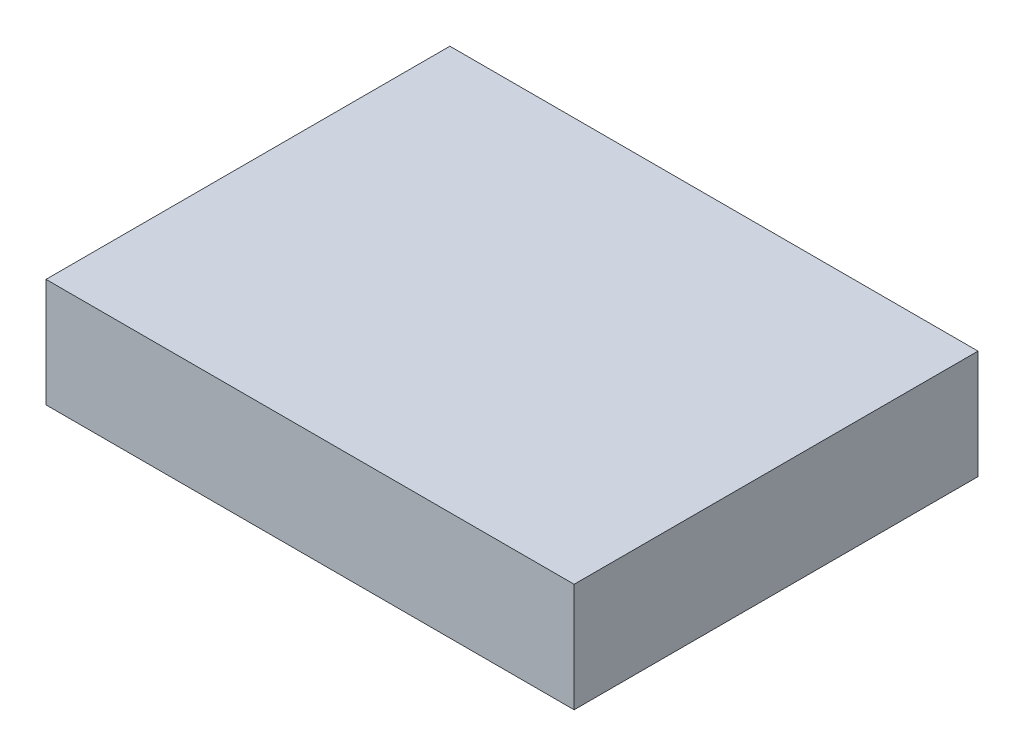
ISO-10303-21;
HEADER;
FILE_DESCRIPTION(('STEP AP214'),'2;1');
FILE_NAME('part.step','',(''),(''),'','','');
FILE_SCHEMA(('AUTOMOTIVE_DESIGN { 1 0 10303 214 1 1 1 1 }'));
ENDSEC;
DATA;
#1=APPLICATION_CONTEXT('core data for automotive mechanical design processes');
#2=APPLICATION_PROTOCOL_DEFINITION('international standard','automotive_design',2000,#1);
#3=PRODUCT_CONTEXT('',#1,'mechanical');
#4=PRODUCT('Part','Part','',(#3));
#5=PRODUCT_RELATED_PRODUCT_CATEGORY('part','',(#4));
#6=PRODUCT_DEFINITION_FORMATION('','',#4);
#7=PRODUCT_DEFINITION_CONTEXT('part definition',#1,'design');
#8=PRODUCT_DEFINITION('design','',#6,#7);
#9=PRODUCT_DEFINITION_SHAPE('','',#8);
#10=(LENGTH_UNIT() NAMED_UNIT(*) SI_UNIT(.MILLI.,.METRE.));
#11=(NAMED_UNIT(*) PLANE_ANGLE_UNIT() SI_UNIT($,.RADIAN.));
#12=(NAMED_UNIT(*) SI_UNIT($,.STERADIAN.) SOLID_ANGLE_UNIT());
#13=UNCERTAINTY_MEASURE_WITH_UNIT(LENGTH_MEASURE(1.E-05),#10,'distance_accuracy_value','');
#14=(GEOMETRIC_REPRESENTATION_CONTEXT(3) GLOBAL_UNCERTAINTY_ASSIGNED_CONTEXT((#13)) GLOBAL_UNIT_ASSIGNED_CONTEXT((#10,
#11,#12)) REPRESENTATION_CONTEXT('',''));
#15=CARTESIAN_POINT('',(0.,0.,0.));
#16=DIRECTION('',(0.,0.,1.));
#17=DIRECTION('',(1.,0.,0.));
#18=AXIS2_PLACEMENT_3D('',#15,#16,#17);
#19=CARTESIAN_POINT('',(21.59,8.89,16.51));
#20=DIRECTION('',(-1.,0.,0.));
#21=DIRECTION('',(0.,0.,1.));
#22=AXIS2_PLACEMENT_3D('',#19,#20,#21);
#23=PLANE('',#22);
#24=DIRECTION('',(0.,0.,-1.));
#25=VECTOR('',#24,1.);
#26=CARTESIAN_POINT('',(21.59,0.,16.51));
#27=LINE('',#26,#25);
#28=CARTESIAN_POINT('',(21.59,0.,16.51));
#29=VERTEX_POINT('',#28);
#30=CARTESIAN_POINT('',(21.59,0.,-16.51));
#31=VERTEX_POINT('',#30);
#32=EDGE_CURVE('E95',#29,#31,#27,.T.);
#33=ORIENTED_EDGE('',*,*,#32,.T.);
#34=DIRECTION('',(0.,-1.,0.));
#35=VECTOR('',#34,1.);
#36=CARTESIAN_POINT('',(21.59,8.89,-16.51));
#37=LINE('',#36,#35);
#38=CARTESIAN_POINT('',(21.59,8.89,-16.51));
#39=VERTEX_POINT('',#38);
#40=EDGE_CURVE('E11',#39,#31,#37,.T.);
#41=ORIENTED_EDGE('',*,*,#40,.F.);
#42=DIRECTION('',(0.,0.,-1.));
#43=VECTOR('',#42,1.);
#44=CARTESIAN_POINT('',(21.59,8.89,16.51));
#45=LINE('',#44,#43);
#46=CARTESIAN_POINT('',(21.59,8.89,16.51));
#47=VERTEX_POINT('',#46);
#48=EDGE_CURVE('E83',#47,#39,#45,.T.);
#49=ORIENTED_EDGE('',*,*,#48,.F.);
#50=DIRECTION('',(0.,-1.,0.));
#51=VECTOR('',#50,1.);
#52=CARTESIAN_POINT('',(21.59,8.89,16.51));
#53=LINE('',#52,#51);
#54=EDGE_CURVE('E91',#47,#29,#53,.T.);
#55=ORIENTED_EDGE('',*,*,#54,.T.);
#56=EDGE_LOOP('',(#33,#41,#49,#55));
#57=FACE_BOUND('',#56,.T.);
#58=ADVANCED_FACE('F32',(#57),#23,.F.);
#59=CARTESIAN_POINT('',(-21.59,8.89,-16.51));
#60=DIRECTION('',(0.,0.,1.));
#61=DIRECTION('',(1.,0.,0.));
#62=AXIS2_PLACEMENT_3D('',#59,#60,#61);
#63=PLANE('',#62);
#64=DIRECTION('',(-1.,0.,0.));
#65=VECTOR('',#64,1.);
#66=CARTESIAN_POINT('',(-21.59,0.,-16.51));
#67=LINE('',#66,#65);
#68=CARTESIAN_POINT('',(-21.59,0.,-16.51));
#69=VERTEX_POINT('',#68);
#70=EDGE_CURVE('E87',#31,#69,#67,.T.);
#71=ORIENTED_EDGE('',*,*,#70,.T.);
#72=DIRECTION('',(0.,-1.,0.));
#73=VECTOR('',#72,1.);
#74=CARTESIAN_POINT('',(-21.59,8.89,-16.51));
#75=LINE('',#74,#73);
#76=CARTESIAN_POINT('',(-21.59,8.89,-16.51));
#77=VERTEX_POINT('',#76);
#78=EDGE_CURVE('E40',#77,#69,#75,.T.);
#79=ORIENTED_EDGE('',*,*,#78,.F.);
#80=DIRECTION('',(-1.,0.,0.));
#81=VECTOR('',#80,1.);
#82=CARTESIAN_POINT('',(-21.59,8.89,-16.51));
#83=LINE('',#82,#81);
#84=EDGE_CURVE('E78',#39,#77,#83,.T.);
#85=ORIENTED_EDGE('',*,*,#84,.F.);
#86=ORIENTED_EDGE('',*,*,#40,.T.);
#87=EDGE_LOOP('',(#71,#79,#85,#86));
#88=FACE_BOUND('',#87,.T.);
#89=ADVANCED_FACE('F86',(#88),#63,.F.);
#90=CARTESIAN_POINT('',(-21.59,8.89,16.51));
#91=DIRECTION('',(1.,0.,0.));
#92=DIRECTION('',(0.,0.,-1.));
#93=AXIS2_PLACEMENT_3D('',#90,#91,#92);
#94=PLANE('',#93);
#95=DIRECTION('',(0.,0.,1.));
#96=VECTOR('',#95,1.);
#97=CARTESIAN_POINT('',(-21.59,0.,16.51));
#98=LINE('',#97,#96);
#99=CARTESIAN_POINT('',(-21.59,0.,16.51));
#100=VERTEX_POINT('',#99);
#101=EDGE_CURVE('E65',#69,#100,#98,.T.);
#102=ORIENTED_EDGE('',*,*,#101,.T.);
#103=DIRECTION('',(0.,-1.,0.));
#104=VECTOR('',#103,1.);
#105=CARTESIAN_POINT('',(-21.59,8.89,16.51));
#106=LINE('',#105,#104);
#107=CARTESIAN_POINT('',(-21.59,8.89,16.51));
#108=VERTEX_POINT('',#107);
#109=EDGE_CURVE('E88',#108,#100,#106,.T.);
#110=ORIENTED_EDGE('',*,*,#109,.F.);
#111=DIRECTION('',(0.,0.,1.));
#112=VECTOR('',#111,1.);
#113=CARTESIAN_POINT('',(-21.59,8.89,16.51));
#114=LINE('',#113,#112);
#115=EDGE_CURVE('E81',#77,#108,#114,.T.);
#116=ORIENTED_EDGE('',*,*,#115,.F.);
#117=ORIENTED_EDGE('',*,*,#78,.T.);
#118=EDGE_LOOP('',(#102,#110,#116,#117));
#119=FACE_BOUND('',#118,.T.);
#120=ADVANCED_FACE('F89',(#119),#94,.F.);
#121=CARTESIAN_POINT('',(-21.59,8.89,16.51));
#122=DIRECTION('',(0.,0.,-1.));
#123=DIRECTION('',(-1.,0.,0.));
#124=AXIS2_PLACEMENT_3D('',#121,#122,#123);
#125=PLANE('',#124);
#126=DIRECTION('',(1.,0.,0.));
#127=VECTOR('',#126,1.);
#128=CARTESIAN_POINT('',(-21.59,0.,16.51));
#129=LINE('',#128,#127);
#130=EDGE_CURVE('E71',#100,#29,#129,.T.);
#131=ORIENTED_EDGE('',*,*,#130,.T.);
#132=ORIENTED_EDGE('',*,*,#54,.F.);
#133=DIRECTION('',(1.,0.,0.));
#134=VECTOR('',#133,1.);
#135=CARTESIAN_POINT('',(-21.59,8.89,16.51));
#136=LINE('',#135,#134);
#137=EDGE_CURVE('E48',#108,#47,#136,.T.);
#138=ORIENTED_EDGE('',*,*,#137,.F.);
#139=ORIENTED_EDGE('',*,*,#109,.T.);
#140=EDGE_LOOP('',(#131,#132,#138,#139));
#141=FACE_BOUND('',#140,.T.);
#142=ADVANCED_FACE('F102',(#141),#125,.F.);
#143=CARTESIAN_POINT('',(0.,8.89,0.));
#144=DIRECTION('',(0.,-1.,0.));
#145=DIRECTION('',(0.,0.,-1.));
#146=AXIS2_PLACEMENT_3D('',#143,#144,#145);
#147=PLANE('',#146);
#148=ORIENTED_EDGE('',*,*,#48,.T.);
#149=ORIENTED_EDGE('',*,*,#84,.T.);
#150=ORIENTED_EDGE('',*,*,#115,.T.);
#151=ORIENTED_EDGE('',*,*,#137,.T.);
#152=EDGE_LOOP('',(#148,#149,#150,#151));
#153=FACE_BOUND('',#152,.T.);
#154=ADVANCED_FACE('F79',(#153),#147,.F.);
#155=CARTESIAN_POINT('',(0.,0.,0.));
#156=DIRECTION('',(0.,-1.,0.));
#157=DIRECTION('',(0.,0.,-1.));
#158=AXIS2_PLACEMENT_3D('',#155,#156,#157);
#159=PLANE('',#158);
#160=ORIENTED_EDGE('',*,*,#32,.F.);
#161=ORIENTED_EDGE('',*,*,#130,.F.);
#162=ORIENTED_EDGE('',*,*,#101,.F.);
#163=ORIENTED_EDGE('',*,*,#70,.F.);
#164=EDGE_LOOP('',(#160,#161,#162,#163));
#165=FACE_BOUND('',#164,.T.);
#166=ADVANCED_FACE('F105',(#165),#159,.T.);
#167=CLOSED_SHELL('',(#58,#89,#120,#142,#154,#166));
#168=MANIFOLD_SOLID_BREP('B2',#167);
#169=ADVANCED_BREP_SHAPE_REPRESENTATION('',(#18,#168),#14);
#170=SHAPE_DEFINITION_REPRESENTATION(#9,#169);
ENDSEC;
END-ISO-10303-21;
